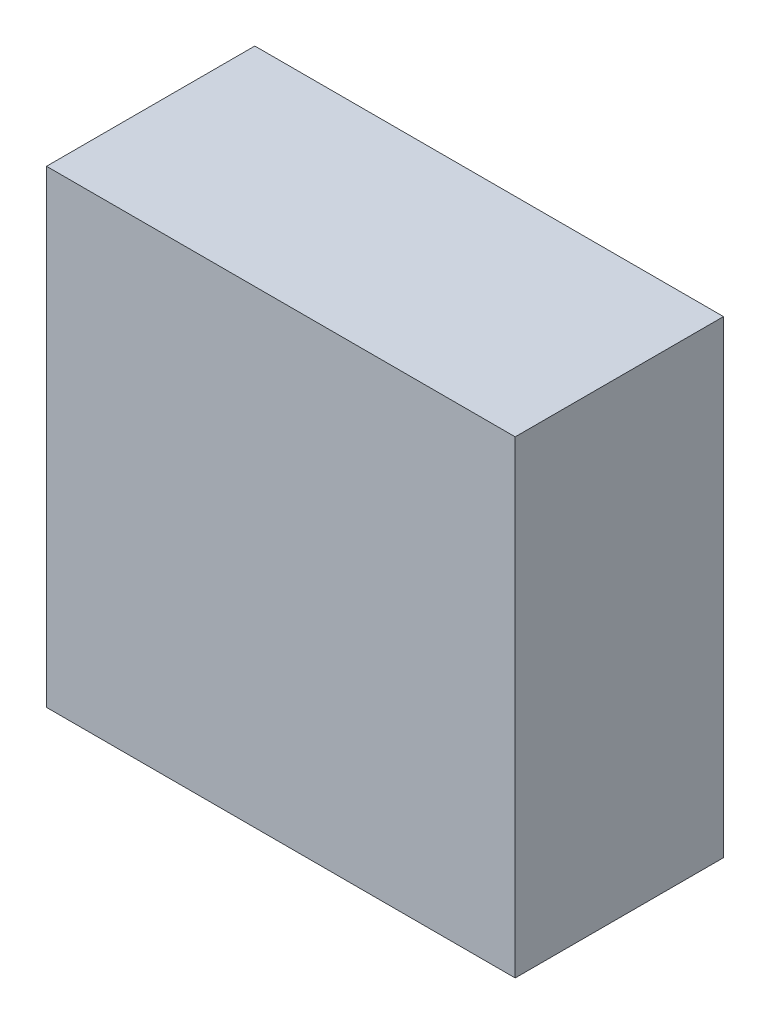
ISO-10303-21;
HEADER;
FILE_DESCRIPTION(('STEP AP214'),'2;1');
FILE_NAME('part.step','',(''),(''),'','','');
FILE_SCHEMA(('AUTOMOTIVE_DESIGN { 1 0 10303 214 1 1 1 1 }'));
ENDSEC;
DATA;
#1=APPLICATION_CONTEXT('core data for automotive mechanical design processes');
#2=APPLICATION_PROTOCOL_DEFINITION('international standard','automotive_design',2000,#1);
#3=PRODUCT_CONTEXT('',#1,'mechanical');
#4=PRODUCT('Part','Part','',(#3));
#5=PRODUCT_RELATED_PRODUCT_CATEGORY('part','',(#4));
#6=PRODUCT_DEFINITION_FORMATION('','',#4);
#7=PRODUCT_DEFINITION_CONTEXT('part definition',#1,'design');
#8=PRODUCT_DEFINITION('design','',#6,#7);
#9=PRODUCT_DEFINITION_SHAPE('','',#8);
#10=(LENGTH_UNIT() NAMED_UNIT(*) SI_UNIT(.MILLI.,.METRE.));
#11=(NAMED_UNIT(*) PLANE_ANGLE_UNIT() SI_UNIT($,.RADIAN.));
#12=(NAMED_UNIT(*) SI_UNIT($,.STERADIAN.) SOLID_ANGLE_UNIT());
#13=UNCERTAINTY_MEASURE_WITH_UNIT(LENGTH_MEASURE(1.E-05),#10,'distance_accuracy_value','');
#14=(GEOMETRIC_REPRESENTATION_CONTEXT(3) GLOBAL_UNCERTAINTY_ASSIGNED_CONTEXT((#13)) GLOBAL_UNIT_ASSIGNED_CONTEXT((#10,
#11,#12)) REPRESENTATION_CONTEXT('',''));
#15=CARTESIAN_POINT('',(0.,0.,0.));
#16=DIRECTION('',(0.,0.,1.));
#17=DIRECTION('',(1.,0.,0.));
#18=AXIS2_PLACEMENT_3D('',#15,#16,#17);
#19=CARTESIAN_POINT('',(36.,-36.,32.));
#20=DIRECTION('',(-1.,0.,0.));
#21=DIRECTION('',(0.,0.,1.));
#22=AXIS2_PLACEMENT_3D('',#19,#20,#21);
#23=PLANE('',#22);
#24=DIRECTION('',(0.,1.,0.));
#25=VECTOR('',#24,1.);
#26=CARTESIAN_POINT('',(36.,-36.,0.));
#27=LINE('',#26,#25);
#28=CARTESIAN_POINT('',(36.,-36.,0.));
#29=VERTEX_POINT('',#28);
#30=CARTESIAN_POINT('',(36.,36.,0.));
#31=VERTEX_POINT('',#30);
#32=EDGE_CURVE('E96',#29,#31,#27,.T.);
#33=ORIENTED_EDGE('',*,*,#32,.T.);
#34=DIRECTION('',(0.,0.,-1.));
#35=VECTOR('',#34,1.);
#36=CARTESIAN_POINT('',(36.,36.,32.));
#37=LINE('',#36,#35);
#38=CARTESIAN_POINT('',(36.,36.,32.));
#39=VERTEX_POINT('',#38);
#40=EDGE_CURVE('E11',#39,#31,#37,.T.);
#41=ORIENTED_EDGE('',*,*,#40,.F.);
#42=DIRECTION('',(0.,1.,0.));
#43=VECTOR('',#42,1.);
#44=CARTESIAN_POINT('',(36.,-36.,32.));
#45=LINE('',#44,#43);
#46=CARTESIAN_POINT('',(36.,-36.,32.));
#47=VERTEX_POINT('',#46);
#48=EDGE_CURVE('E84',#47,#39,#45,.T.);
#49=ORIENTED_EDGE('',*,*,#48,.F.);
#50=DIRECTION('',(0.,0.,-1.));
#51=VECTOR('',#50,1.);
#52=CARTESIAN_POINT('',(36.,-36.,32.));
#53=LINE('',#52,#51);
#54=EDGE_CURVE('E92',#47,#29,#53,.T.);
#55=ORIENTED_EDGE('',*,*,#54,.T.);
#56=EDGE_LOOP('',(#33,#41,#49,#55));
#57=FACE_BOUND('',#56,.T.);
#58=ADVANCED_FACE('F33',(#57),#23,.F.);
#59=CARTESIAN_POINT('',(-36.,36.,32.));
#60=DIRECTION('',(0.,-1.,0.));
#61=DIRECTION('',(0.,0.,-1.));
#62=AXIS2_PLACEMENT_3D('',#59,#60,#61);
#63=PLANE('',#62);
#64=DIRECTION('',(-1.,0.,0.));
#65=VECTOR('',#64,1.);
#66=CARTESIAN_POINT('',(-36.,36.,0.));
#67=LINE('',#66,#65);
#68=CARTESIAN_POINT('',(-36.,36.,0.));
#69=VERTEX_POINT('',#68);
#70=EDGE_CURVE('E88',#31,#69,#67,.T.);
#71=ORIENTED_EDGE('',*,*,#70,.T.);
#72=DIRECTION('',(0.,0.,-1.));
#73=VECTOR('',#72,1.);
#74=CARTESIAN_POINT('',(-36.,36.,32.));
#75=LINE('',#74,#73);
#76=CARTESIAN_POINT('',(-36.,36.,32.));
#77=VERTEX_POINT('',#76);
#78=EDGE_CURVE('E41',#77,#69,#75,.T.);
#79=ORIENTED_EDGE('',*,*,#78,.F.);
#80=DIRECTION('',(-1.,0.,0.));
#81=VECTOR('',#80,1.);
#82=CARTESIAN_POINT('',(-36.,36.,32.));
#83=LINE('',#82,#81);
#84=EDGE_CURVE('E79',#39,#77,#83,.T.);
#85=ORIENTED_EDGE('',*,*,#84,.F.);
#86=ORIENTED_EDGE('',*,*,#40,.T.);
#87=EDGE_LOOP('',(#71,#79,#85,#86));
#88=FACE_BOUND('',#87,.T.);
#89=ADVANCED_FACE('F87',(#88),#63,.F.);
#90=CARTESIAN_POINT('',(-36.,-36.,32.));
#91=DIRECTION('',(1.,0.,0.));
#92=DIRECTION('',(0.,0.,-1.));
#93=AXIS2_PLACEMENT_3D('',#90,#91,#92);
#94=PLANE('',#93);
#95=DIRECTION('',(0.,-1.,0.));
#96=VECTOR('',#95,1.);
#97=CARTESIAN_POINT('',(-36.,-36.,0.));
#98=LINE('',#97,#96);
#99=CARTESIAN_POINT('',(-36.,-36.,0.));
#100=VERTEX_POINT('',#99);
#101=EDGE_CURVE('E66',#69,#100,#98,.T.);
#102=ORIENTED_EDGE('',*,*,#101,.T.);
#103=DIRECTION('',(0.,0.,-1.));
#104=VECTOR('',#103,1.);
#105=CARTESIAN_POINT('',(-36.,-36.,32.));
#106=LINE('',#105,#104);
#107=CARTESIAN_POINT('',(-36.,-36.,32.));
#108=VERTEX_POINT('',#107);
#109=EDGE_CURVE('E89',#108,#100,#106,.T.);
#110=ORIENTED_EDGE('',*,*,#109,.F.);
#111=DIRECTION('',(0.,-1.,0.));
#112=VECTOR('',#111,1.);
#113=CARTESIAN_POINT('',(-36.,-36.,32.));
#114=LINE('',#113,#112);
#115=EDGE_CURVE('E82',#77,#108,#114,.T.);
#116=ORIENTED_EDGE('',*,*,#115,.F.);
#117=ORIENTED_EDGE('',*,*,#78,.T.);
#118=EDGE_LOOP('',(#102,#110,#116,#117));
#119=FACE_BOUND('',#118,.T.);
#120=ADVANCED_FACE('F90',(#119),#94,.F.);
#121=CARTESIAN_POINT('',(-36.,-36.,32.));
#122=DIRECTION('',(0.,1.,0.));
#123=DIRECTION('',(0.,0.,1.));
#124=AXIS2_PLACEMENT_3D('',#121,#122,#123);
#125=PLANE('',#124);
#126=DIRECTION('',(1.,0.,0.));
#127=VECTOR('',#126,1.);
#128=CARTESIAN_POINT('',(-36.,-36.,0.));
#129=LINE('',#128,#127);
#130=EDGE_CURVE('E72',#100,#29,#129,.T.);
#131=ORIENTED_EDGE('',*,*,#130,.T.);
#132=ORIENTED_EDGE('',*,*,#54,.F.);
#133=DIRECTION('',(1.,0.,0.));
#134=VECTOR('',#133,1.);
#135=CARTESIAN_POINT('',(-36.,-36.,32.));
#136=LINE('',#135,#134);
#137=EDGE_CURVE('E49',#108,#47,#136,.T.);
#138=ORIENTED_EDGE('',*,*,#137,.F.);
#139=ORIENTED_EDGE('',*,*,#109,.T.);
#140=EDGE_LOOP('',(#131,#132,#138,#139));
#141=FACE_BOUND('',#140,.T.);
#142=ADVANCED_FACE('F103',(#141),#125,.F.);
#143=CARTESIAN_POINT('',(0.,0.,32.));
#144=DIRECTION('',(0.,0.,-1.));
#145=DIRECTION('',(-1.,0.,0.));
#146=AXIS2_PLACEMENT_3D('',#143,#144,#145);
#147=PLANE('',#146);
#148=ORIENTED_EDGE('',*,*,#48,.T.);
#149=ORIENTED_EDGE('',*,*,#84,.T.);
#150=ORIENTED_EDGE('',*,*,#115,.T.);
#151=ORIENTED_EDGE('',*,*,#137,.T.);
#152=EDGE_LOOP('',(#148,#149,#150,#151));
#153=FACE_BOUND('',#152,.T.);
#154=ADVANCED_FACE('F80',(#153),#147,.F.);
#155=CARTESIAN_POINT('',(0.,0.,0.));
#156=DIRECTION('',(0.,0.,-1.));
#157=DIRECTION('',(-1.,0.,0.));
#158=AXIS2_PLACEMENT_3D('',#155,#156,#157);
#159=PLANE('',#158);
#160=ORIENTED_EDGE('',*,*,#32,.F.);
#161=ORIENTED_EDGE('',*,*,#130,.F.);
#162=ORIENTED_EDGE('',*,*,#101,.F.);
#163=ORIENTED_EDGE('',*,*,#70,.F.);
#164=EDGE_LOOP('',(#160,#161,#162,#163));
#165=FACE_BOUND('',#164,.T.);
#166=ADVANCED_FACE('F106',(#165),#159,.T.);
#167=CLOSED_SHELL('',(#58,#89,#120,#142,#154,#166));
#168=MANIFOLD_SOLID_BREP('B2',#167);
#169=ADVANCED_BREP_SHAPE_REPRESENTATION('',(#18,#168),#14);
#170=SHAPE_DEFINITION_REPRESENTATION(#9,#169);
ENDSEC;
END-ISO-10303-21;
